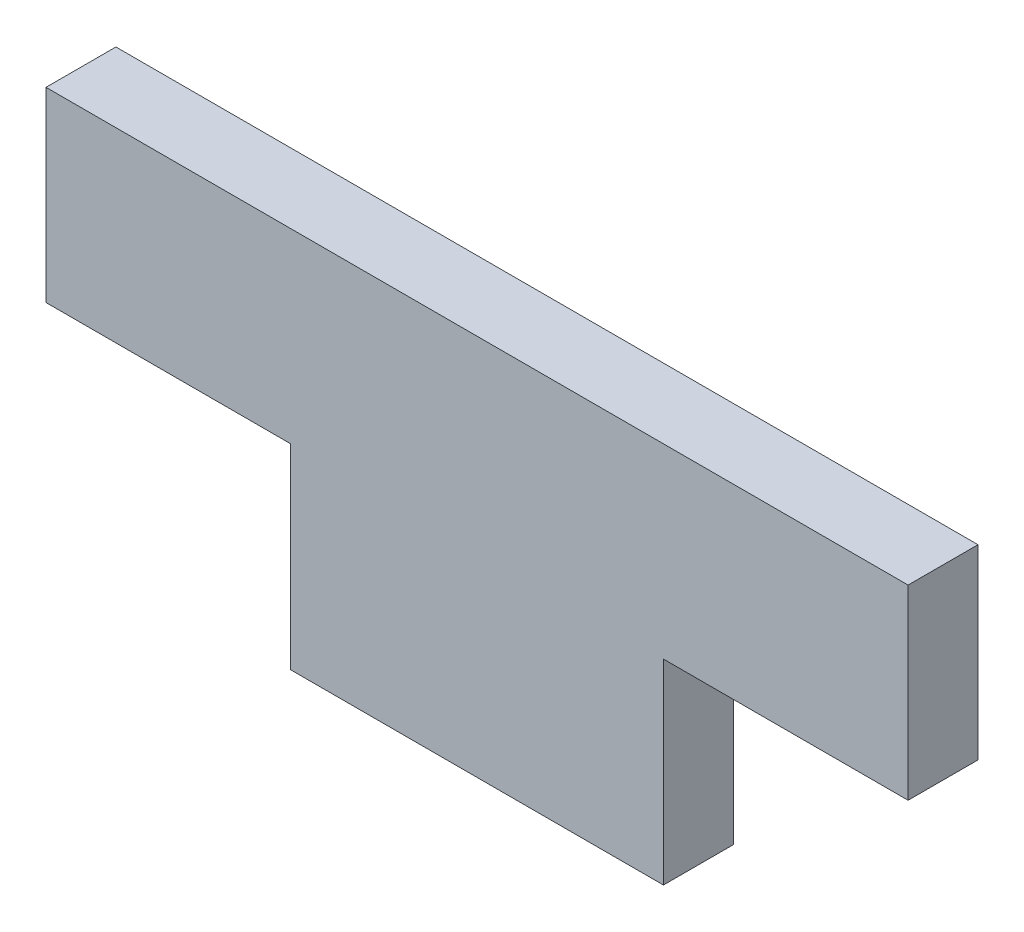
ISO-10303-21;
HEADER;
FILE_DESCRIPTION(('STEP AP214'),'2;1');
FILE_NAME('part.step','',(''),(''),'','','');
FILE_SCHEMA(('AUTOMOTIVE_DESIGN { 1 0 10303 214 1 1 1 1 }'));
ENDSEC;
DATA;
#1=APPLICATION_CONTEXT('core data for automotive mechanical design processes');
#2=APPLICATION_PROTOCOL_DEFINITION('international standard','automotive_design',2000,#1);
#3=PRODUCT_CONTEXT('',#1,'mechanical');
#4=PRODUCT('Part','Part','',(#3));
#5=PRODUCT_RELATED_PRODUCT_CATEGORY('part','',(#4));
#6=PRODUCT_DEFINITION_FORMATION('','',#4);
#7=PRODUCT_DEFINITION_CONTEXT('part definition',#1,'design');
#8=PRODUCT_DEFINITION('design','',#6,#7);
#9=PRODUCT_DEFINITION_SHAPE('','',#8);
#10=(LENGTH_UNIT() NAMED_UNIT(*) SI_UNIT(.MILLI.,.METRE.));
#11=(NAMED_UNIT(*) PLANE_ANGLE_UNIT() SI_UNIT($,.RADIAN.));
#12=(NAMED_UNIT(*) SI_UNIT($,.STERADIAN.) SOLID_ANGLE_UNIT());
#13=UNCERTAINTY_MEASURE_WITH_UNIT(LENGTH_MEASURE(1.E-05),#10,'distance_accuracy_value','');
#14=(GEOMETRIC_REPRESENTATION_CONTEXT(3) GLOBAL_UNCERTAINTY_ASSIGNED_CONTEXT((#13)) GLOBAL_UNIT_ASSIGNED_CONTEXT((#10,
#11,#12)) REPRESENTATION_CONTEXT('',''));
#15=CARTESIAN_POINT('',(0.,0.,0.));
#16=DIRECTION('',(0.,0.,1.));
#17=DIRECTION('',(1.,0.,0.));
#18=AXIS2_PLACEMENT_3D('',#15,#16,#17);
#19=CARTESIAN_POINT('',(-9.25,-2.,0.75));
#20=DIRECTION('',(0.,1.,0.));
#21=DIRECTION('',(0.,0.,1.));
#22=AXIS2_PLACEMENT_3D('',#19,#20,#21);
#23=PLANE('',#22);
#24=DIRECTION('',(0.,0.,-1.));
#25=VECTOR('',#24,1.);
#26=CARTESIAN_POINT('',(4.,-2.,0.75));
#27=LINE('',#26,#25);
#28=CARTESIAN_POINT('',(4.,-2.,0.75));
#29=VERTEX_POINT('',#28);
#30=CARTESIAN_POINT('',(4.,-2.,-0.75));
#31=VERTEX_POINT('',#30);
#32=EDGE_CURVE('E149',#29,#31,#27,.T.);
#33=ORIENTED_EDGE('',*,*,#32,.T.);
#34=DIRECTION('',(1.,0.,0.));
#35=VECTOR('',#34,1.);
#36=CARTESIAN_POINT('',(-9.25,-2.,-0.75));
#37=LINE('',#36,#35);
#38=CARTESIAN_POINT('',(9.25,-2.,-0.75));
#39=VERTEX_POINT('',#38);
#40=EDGE_CURVE('E121',#31,#39,#37,.T.);
#41=ORIENTED_EDGE('',*,*,#40,.T.);
#42=DIRECTION('',(0.,0.,-1.));
#43=VECTOR('',#42,1.);
#44=CARTESIAN_POINT('',(9.25,-2.,0.75));
#45=LINE('',#44,#43);
#46=CARTESIAN_POINT('',(9.25,-2.,0.75));
#47=VERTEX_POINT('',#46);
#48=EDGE_CURVE('E164',#47,#39,#45,.T.);
#49=ORIENTED_EDGE('',*,*,#48,.F.);
#50=DIRECTION('',(1.,0.,0.));
#51=VECTOR('',#50,1.);
#52=CARTESIAN_POINT('',(-9.25,-2.,0.75));
#53=LINE('',#52,#51);
#54=EDGE_CURVE('E58',#29,#47,#53,.T.);
#55=ORIENTED_EDGE('',*,*,#54,.F.);
#56=EDGE_LOOP('',(#33,#41,#49,#55));
#57=FACE_BOUND('',#56,.T.);
#58=ADVANCED_FACE('F33',(#57),#23,.F.);
#59=CARTESIAN_POINT('',(9.25,-2.,0.75));
#60=DIRECTION('',(-1.,0.,0.));
#61=DIRECTION('',(0.,0.,1.));
#62=AXIS2_PLACEMENT_3D('',#59,#60,#61);
#63=PLANE('',#62);
#64=ORIENTED_EDGE('',*,*,#48,.T.);
#65=DIRECTION('',(0.,1.,0.));
#66=VECTOR('',#65,1.);
#67=CARTESIAN_POINT('',(9.25,-2.,-0.75));
#68=LINE('',#67,#66);
#69=CARTESIAN_POINT('',(9.25,2.,-0.75));
#70=VERTEX_POINT('',#69);
#71=EDGE_CURVE('E127',#39,#70,#68,.T.);
#72=ORIENTED_EDGE('',*,*,#71,.T.);
#73=DIRECTION('',(0.,0.,-1.));
#74=VECTOR('',#73,1.);
#75=CARTESIAN_POINT('',(9.25,2.,0.75));
#76=LINE('',#75,#74);
#77=CARTESIAN_POINT('',(9.25,2.,0.75));
#78=VERTEX_POINT('',#77);
#79=EDGE_CURVE('E11',#78,#70,#76,.T.);
#80=ORIENTED_EDGE('',*,*,#79,.F.);
#81=DIRECTION('',(0.,1.,0.));
#82=VECTOR('',#81,1.);
#83=CARTESIAN_POINT('',(9.25,-2.,0.75));
#84=LINE('',#83,#82);
#85=EDGE_CURVE('E155',#47,#78,#84,.T.);
#86=ORIENTED_EDGE('',*,*,#85,.F.);
#87=EDGE_LOOP('',(#64,#72,#80,#86));
#88=FACE_BOUND('',#87,.T.);
#89=ADVANCED_FACE('F35',(#88),#63,.F.);
#90=CARTESIAN_POINT('',(-9.25,2.,0.75));
#91=DIRECTION('',(0.,-1.,0.));
#92=DIRECTION('',(0.,0.,-1.));
#93=AXIS2_PLACEMENT_3D('',#90,#91,#92);
#94=PLANE('',#93);
#95=ORIENTED_EDGE('',*,*,#79,.T.);
#96=DIRECTION('',(-1.,0.,0.));
#97=VECTOR('',#96,1.);
#98=CARTESIAN_POINT('',(-9.25,2.,-0.75));
#99=LINE('',#98,#97);
#100=CARTESIAN_POINT('',(-9.25,2.,-0.75));
#101=VERTEX_POINT('',#100);
#102=EDGE_CURVE('E137',#70,#101,#99,.T.);
#103=ORIENTED_EDGE('',*,*,#102,.T.);
#104=DIRECTION('',(0.,0.,-1.));
#105=VECTOR('',#104,1.);
#106=CARTESIAN_POINT('',(-9.25,2.,0.75));
#107=LINE('',#106,#105);
#108=CARTESIAN_POINT('',(-9.25,2.,0.75));
#109=VERTEX_POINT('',#108);
#110=EDGE_CURVE('E42',#109,#101,#107,.T.);
#111=ORIENTED_EDGE('',*,*,#110,.F.);
#112=DIRECTION('',(-1.,0.,0.));
#113=VECTOR('',#112,1.);
#114=CARTESIAN_POINT('',(-9.25,2.,0.75));
#115=LINE('',#114,#113);
#116=EDGE_CURVE('E181',#78,#109,#115,.T.);
#117=ORIENTED_EDGE('',*,*,#116,.F.);
#118=EDGE_LOOP('',(#95,#103,#111,#117));
#119=FACE_BOUND('',#118,.T.);
#120=ADVANCED_FACE('F179',(#119),#94,.F.);
#121=CARTESIAN_POINT('',(-9.25,-2.,0.75));
#122=DIRECTION('',(1.,0.,0.));
#123=DIRECTION('',(0.,0.,-1.));
#124=AXIS2_PLACEMENT_3D('',#121,#122,#123);
#125=PLANE('',#124);
#126=ORIENTED_EDGE('',*,*,#110,.T.);
#127=DIRECTION('',(0.,-1.,0.));
#128=VECTOR('',#127,1.);
#129=CARTESIAN_POINT('',(-9.25,-2.,-0.75));
#130=LINE('',#129,#128);
#131=CARTESIAN_POINT('',(-9.25,-2.,-0.75));
#132=VERTEX_POINT('',#131);
#133=EDGE_CURVE('E134',#101,#132,#130,.T.);
#134=ORIENTED_EDGE('',*,*,#133,.T.);
#135=DIRECTION('',(0.,0.,-1.));
#136=VECTOR('',#135,1.);
#137=CARTESIAN_POINT('',(-9.25,-2.,0.75));
#138=LINE('',#137,#136);
#139=CARTESIAN_POINT('',(-9.25,-2.,0.75));
#140=VERTEX_POINT('',#139);
#141=EDGE_CURVE('E168',#140,#132,#138,.T.);
#142=ORIENTED_EDGE('',*,*,#141,.F.);
#143=DIRECTION('',(0.,-1.,0.));
#144=VECTOR('',#143,1.);
#145=CARTESIAN_POINT('',(-9.25,-2.,0.75));
#146=LINE('',#145,#144);
#147=EDGE_CURVE('E159',#109,#140,#146,.T.);
#148=ORIENTED_EDGE('',*,*,#147,.F.);
#149=EDGE_LOOP('',(#126,#134,#142,#148));
#150=FACE_BOUND('',#149,.T.);
#151=ADVANCED_FACE('F174',(#150),#125,.F.);
#152=CARTESIAN_POINT('',(-4.,-2.,-0.75));
#153=VERTEX_POINT('',#152);
#154=EDGE_CURVE('E132',#132,#153,#37,.T.);
#155=ORIENTED_EDGE('',*,*,#154,.T.);
#156=DIRECTION('',(0.,0.,-1.));
#157=VECTOR('',#156,1.);
#158=CARTESIAN_POINT('',(-4.,-2.,0.75));
#159=LINE('',#158,#157);
#160=CARTESIAN_POINT('',(-4.,-2.,0.75));
#161=VERTEX_POINT('',#160);
#162=EDGE_CURVE('E50',#161,#153,#159,.T.);
#163=ORIENTED_EDGE('',*,*,#162,.F.);
#164=EDGE_CURVE('E158',#140,#161,#53,.T.);
#165=ORIENTED_EDGE('',*,*,#164,.F.);
#166=ORIENTED_EDGE('',*,*,#141,.T.);
#167=EDGE_LOOP('',(#155,#163,#165,#166));
#168=FACE_BOUND('',#167,.T.);
#169=ADVANCED_FACE('F187',(#168),#23,.F.);
#170=CARTESIAN_POINT('',(0.,0.,0.75));
#171=DIRECTION('',(0.,0.,-1.));
#172=DIRECTION('',(-1.,0.,0.));
#173=AXIS2_PLACEMENT_3D('',#170,#171,#172);
#174=PLANE('',#173);
#175=ORIENTED_EDGE('',*,*,#85,.T.);
#176=ORIENTED_EDGE('',*,*,#116,.T.);
#177=ORIENTED_EDGE('',*,*,#147,.T.);
#178=ORIENTED_EDGE('',*,*,#164,.T.);
#179=DIRECTION('',(0.,-1.,0.));
#180=VECTOR('',#179,1.);
#181=CARTESIAN_POINT('',(-4.,-2.,0.75));
#182=LINE('',#181,#180);
#183=CARTESIAN_POINT('',(-4.,-6.2,0.75));
#184=VERTEX_POINT('',#183);
#185=EDGE_CURVE('E140',#161,#184,#182,.T.);
#186=ORIENTED_EDGE('',*,*,#185,.T.);
#187=DIRECTION('',(1.,0.,0.));
#188=VECTOR('',#187,1.);
#189=CARTESIAN_POINT('',(4.,-6.2,0.75));
#190=LINE('',#189,#188);
#191=CARTESIAN_POINT('',(4.,-6.2,0.75));
#192=VERTEX_POINT('',#191);
#193=EDGE_CURVE('E112',#184,#192,#190,.T.);
#194=ORIENTED_EDGE('',*,*,#193,.T.);
#195=DIRECTION('',(0.,1.,0.));
#196=VECTOR('',#195,1.);
#197=CARTESIAN_POINT('',(4.,-2.,0.75));
#198=LINE('',#197,#196);
#199=EDGE_CURVE('E107',#192,#29,#198,.T.);
#200=ORIENTED_EDGE('',*,*,#199,.T.);
#201=ORIENTED_EDGE('',*,*,#54,.T.);
#202=EDGE_LOOP('',(#175,#176,#177,#178,#186,#194,#200,#201));
#203=FACE_BOUND('',#202,.T.);
#204=ADVANCED_FACE('F195',(#203),#174,.F.);
#205=CARTESIAN_POINT('',(4.,-2.,0.75));
#206=DIRECTION('',(-1.,0.,0.));
#207=DIRECTION('',(0.,-1.,0.));
#208=AXIS2_PLACEMENT_3D('',#205,#206,#207);
#209=PLANE('',#208);
#210=DIRECTION('',(0.,0.,-1.));
#211=VECTOR('',#210,1.);
#212=CARTESIAN_POINT('',(4.,-6.2,0.75));
#213=LINE('',#212,#211);
#214=CARTESIAN_POINT('',(4.,-6.2,-0.75));
#215=VERTEX_POINT('',#214);
#216=EDGE_CURVE('E102',#192,#215,#213,.T.);
#217=ORIENTED_EDGE('',*,*,#216,.T.);
#218=DIRECTION('',(0.,1.,0.));
#219=VECTOR('',#218,1.);
#220=CARTESIAN_POINT('',(4.,-2.,-0.75));
#221=LINE('',#220,#219);
#222=EDGE_CURVE('E106',#215,#31,#221,.T.);
#223=ORIENTED_EDGE('',*,*,#222,.T.);
#224=ORIENTED_EDGE('',*,*,#32,.F.);
#225=ORIENTED_EDGE('',*,*,#199,.F.);
#226=EDGE_LOOP('',(#217,#223,#224,#225));
#227=FACE_BOUND('',#226,.T.);
#228=ADVANCED_FACE('F104',(#227),#209,.F.);
#229=CARTESIAN_POINT('',(-4.,-2.,0.75));
#230=DIRECTION('',(1.,0.,0.));
#231=DIRECTION('',(0.,1.,0.));
#232=AXIS2_PLACEMENT_3D('',#229,#230,#231);
#233=PLANE('',#232);
#234=ORIENTED_EDGE('',*,*,#162,.T.);
#235=DIRECTION('',(0.,-1.,0.));
#236=VECTOR('',#235,1.);
#237=CARTESIAN_POINT('',(-4.,-2.,-0.75));
#238=LINE('',#237,#236);
#239=CARTESIAN_POINT('',(-4.,-6.2,-0.75));
#240=VERTEX_POINT('',#239);
#241=EDGE_CURVE('E125',#153,#240,#238,.T.);
#242=ORIENTED_EDGE('',*,*,#241,.T.);
#243=DIRECTION('',(0.,0.,-1.));
#244=VECTOR('',#243,1.);
#245=CARTESIAN_POINT('',(-4.,-6.2,0.75));
#246=LINE('',#245,#244);
#247=EDGE_CURVE('E111',#184,#240,#246,.T.);
#248=ORIENTED_EDGE('',*,*,#247,.F.);
#249=ORIENTED_EDGE('',*,*,#185,.F.);
#250=EDGE_LOOP('',(#234,#242,#248,#249));
#251=FACE_BOUND('',#250,.T.);
#252=ADVANCED_FACE('F202',(#251),#233,.F.);
#253=CARTESIAN_POINT('',(4.,-6.2,0.75));
#254=DIRECTION('',(0.,1.,0.));
#255=DIRECTION('',(-1.,0.,0.));
#256=AXIS2_PLACEMENT_3D('',#253,#254,#255);
#257=PLANE('',#256);
#258=ORIENTED_EDGE('',*,*,#247,.T.);
#259=DIRECTION('',(1.,0.,0.));
#260=VECTOR('',#259,1.);
#261=CARTESIAN_POINT('',(4.,-6.2,-0.75));
#262=LINE('',#261,#260);
#263=EDGE_CURVE('E120',#240,#215,#262,.T.);
#264=ORIENTED_EDGE('',*,*,#263,.T.);
#265=ORIENTED_EDGE('',*,*,#216,.F.);
#266=ORIENTED_EDGE('',*,*,#193,.F.);
#267=EDGE_LOOP('',(#258,#264,#265,#266));
#268=FACE_BOUND('',#267,.T.);
#269=ADVANCED_FACE('F123',(#268),#257,.F.);
#270=CARTESIAN_POINT('',(0.,0.,-0.75));
#271=DIRECTION('',(0.,0.,1.));
#272=DIRECTION('',(-1.,0.,0.));
#273=AXIS2_PLACEMENT_3D('',#270,#271,#272);
#274=PLANE('',#273);
#275=ORIENTED_EDGE('',*,*,#71,.F.);
#276=ORIENTED_EDGE('',*,*,#40,.F.);
#277=ORIENTED_EDGE('',*,*,#222,.F.);
#278=ORIENTED_EDGE('',*,*,#263,.F.);
#279=ORIENTED_EDGE('',*,*,#241,.F.);
#280=ORIENTED_EDGE('',*,*,#154,.F.);
#281=ORIENTED_EDGE('',*,*,#133,.F.);
#282=ORIENTED_EDGE('',*,*,#102,.F.);
#283=EDGE_LOOP('',(#275,#276,#277,#278,#279,#280,#281,#282));
#284=FACE_BOUND('',#283,.T.);
#285=ADVANCED_FACE('F118',(#284),#274,.F.);
#286=CLOSED_SHELL('',(#58,#89,#120,#151,#169,#204,#228,#252,#269,#285));
#287=MANIFOLD_SOLID_BREP('B2',#286);
#288=ADVANCED_BREP_SHAPE_REPRESENTATION('',(#18,#287),#14);
#289=SHAPE_DEFINITION_REPRESENTATION(#9,#288);
ENDSEC;
END-ISO-10303-21;
